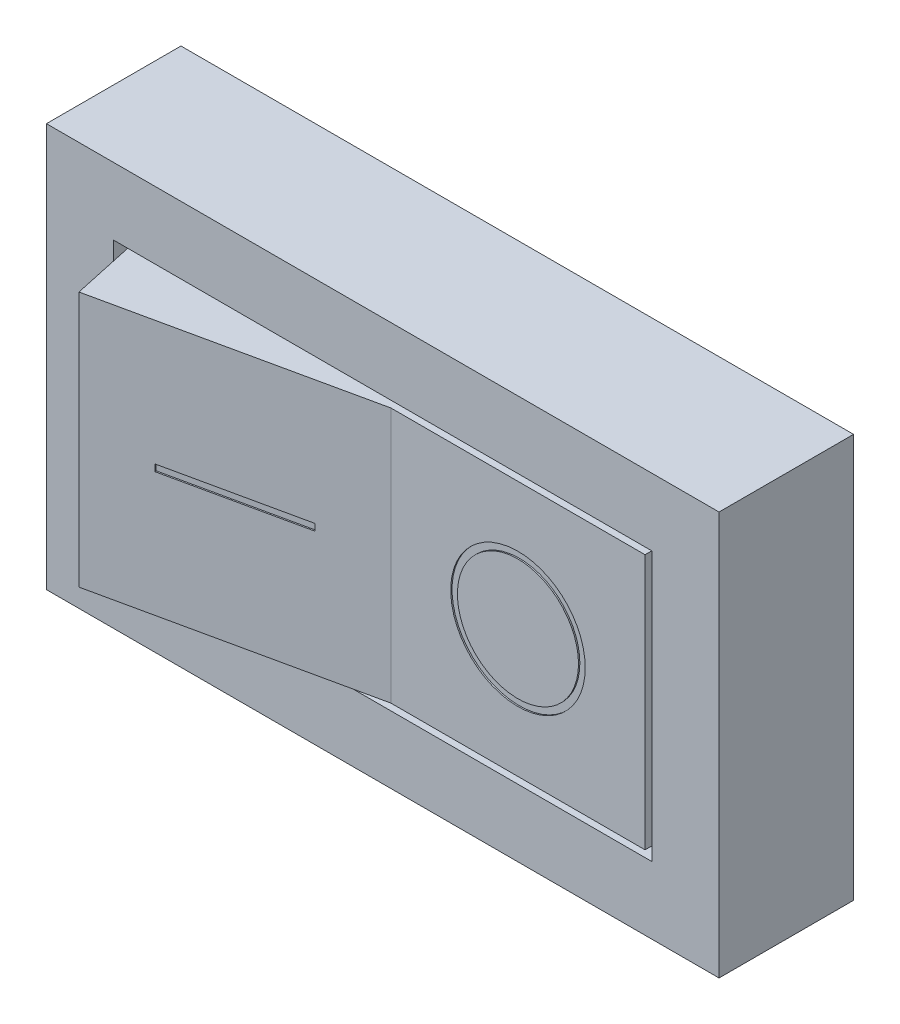
ISO-10303-21;
HEADER;
FILE_DESCRIPTION(('STEP AP214'),'2;1');
FILE_NAME('part.step','',(''),(''),'','','');
FILE_SCHEMA(('AUTOMOTIVE_DESIGN { 1 0 10303 214 1 1 1 1 }'));
ENDSEC;
DATA;
#1=APPLICATION_CONTEXT('core data for automotive mechanical design processes');
#2=APPLICATION_PROTOCOL_DEFINITION('international standard','automotive_design',2000,#1);
#3=PRODUCT_CONTEXT('',#1,'mechanical');
#4=PRODUCT('Part','Part','',(#3));
#5=PRODUCT_RELATED_PRODUCT_CATEGORY('part','',(#4));
#6=PRODUCT_DEFINITION_FORMATION('','',#4);
#7=PRODUCT_DEFINITION_CONTEXT('part definition',#1,'design');
#8=PRODUCT_DEFINITION('design','',#6,#7);
#9=PRODUCT_DEFINITION_SHAPE('','',#8);
#10=(LENGTH_UNIT() NAMED_UNIT(*) SI_UNIT(.MILLI.,.METRE.));
#11=(NAMED_UNIT(*) PLANE_ANGLE_UNIT() SI_UNIT($,.RADIAN.));
#12=(NAMED_UNIT(*) SI_UNIT($,.STERADIAN.) SOLID_ANGLE_UNIT());
#13=UNCERTAINTY_MEASURE_WITH_UNIT(LENGTH_MEASURE(1.E-05),#10,'distance_accuracy_value','');
#14=(GEOMETRIC_REPRESENTATION_CONTEXT(3) GLOBAL_UNCERTAINTY_ASSIGNED_CONTEXT((#13)) GLOBAL_UNIT_ASSIGNED_CONTEXT((#10,
#11,#12)) REPRESENTATION_CONTEXT('',''));
#15=CARTESIAN_POINT('',(0.,0.,0.));
#16=DIRECTION('',(0.,0.,1.));
#17=DIRECTION('',(1.,0.,0.));
#18=AXIS2_PLACEMENT_3D('',#15,#16,#17);
#19=CARTESIAN_POINT('',(0.141550344407691,-8.5259383359687,10.));
#20=DIRECTION('',(0.,1.,0.));
#21=DIRECTION('',(0.,0.,1.));
#22=AXIS2_PLACEMENT_3D('',#19,#20,#21);
#23=PLANE('',#22);
#24=DIRECTION('',(1.,0.,0.));
#25=VECTOR('',#24,1.);
#26=CARTESIAN_POINT('',(0.141550344407691,-8.5259383359687,10.));
#27=LINE('',#26,#25);
#28=CARTESIAN_POINT('',(1.24615811867557,-8.5259383359687,10.));
#29=VERTEX_POINT('',#28);
#30=CARTESIAN_POINT('',(20.1415503444077,-8.5259383359687,10.));
#31=VERTEX_POINT('',#30);
#32=EDGE_CURVE('E220',#29,#31,#27,.T.);
#33=ORIENTED_EDGE('',*,*,#32,.F.);
#34=DIRECTION('',(0.977349842779431,0.,-0.211630065961862));
#35=VECTOR('',#34,1.);
#36=CARTESIAN_POINT('',(-17.8121638155233,-8.5259383359687,14.1267862862563));
#37=LINE('',#36,#35);
#38=CARTESIAN_POINT('',(-17.8121638155233,-8.5259383359687,14.1267862862563));
#39=VERTEX_POINT('',#38);
#40=EDGE_CURVE('E208',#39,#29,#37,.T.);
#41=ORIENTED_EDGE('',*,*,#40,.F.);
#42=DIRECTION('',(0.211630065961862,0.,0.977349842779431));
#43=VECTOR('',#42,1.);
#44=CARTESIAN_POINT('',(-17.8121638155233,-8.5259383359687,14.1267862862563));
#45=LINE('',#44,#43);
#46=CARTESIAN_POINT('',(-18.8948368600087,-8.5259383359687,9.12678628625632));
#47=VERTEX_POINT('',#46);
#48=EDGE_CURVE('E206',#47,#39,#45,.T.);
#49=ORIENTED_EDGE('',*,*,#48,.F.);
#50=DIRECTION('',(0.977349842779431,0.,-0.211630065961862));
#51=VECTOR('',#50,1.);
#52=CARTESIAN_POINT('',(-18.8948368600087,-8.5259383359687,9.12678628625632));
#53=LINE('',#52,#51);
#54=CARTESIAN_POINT('',(0.163485074190188,-8.5259383359687,5.));
#55=VERTEX_POINT('',#54);
#56=EDGE_CURVE('E210',#47,#55,#53,.T.);
#57=ORIENTED_EDGE('',*,*,#56,.T.);
#58=DIRECTION('',(1.,0.,0.));
#59=VECTOR('',#58,1.);
#60=CARTESIAN_POINT('',(0.141550344407691,-8.5259383359687,5.));
#61=LINE('',#60,#59);
#62=CARTESIAN_POINT('',(20.1415503444077,-8.5259383359687,5.));
#63=VERTEX_POINT('',#62);
#64=EDGE_CURVE('E219',#55,#63,#61,.T.);
#65=ORIENTED_EDGE('',*,*,#64,.T.);
#66=DIRECTION('',(0.,0.,-1.));
#67=VECTOR('',#66,1.);
#68=CARTESIAN_POINT('',(20.1415503444077,-8.5259383359687,10.));
#69=LINE('',#68,#67);
#70=EDGE_CURVE('E80',#31,#63,#69,.T.);
#71=ORIENTED_EDGE('',*,*,#70,.F.);
#72=EDGE_LOOP('',(#33,#41,#49,#57,#65,#71));
#73=FACE_BOUND('',#72,.T.);
#74=ADVANCED_FACE('F73',(#73),#23,.F.);
#75=CARTESIAN_POINT('',(20.1415503444077,10.4740616640313,10.));
#76=DIRECTION('',(-1.,0.,0.));
#77=DIRECTION('',(0.,0.,1.));
#78=AXIS2_PLACEMENT_3D('',#75,#76,#77);
#79=PLANE('',#78);
#80=DIRECTION('',(0.,1.,0.));
#81=VECTOR('',#80,1.);
#82=CARTESIAN_POINT('',(20.1415503444077,10.4740616640313,5.));
#83=LINE('',#82,#81);
#84=CARTESIAN_POINT('',(20.1415503444077,10.4740616640313,5.));
#85=VERTEX_POINT('',#84);
#86=EDGE_CURVE('E230',#63,#85,#83,.T.);
#87=ORIENTED_EDGE('',*,*,#86,.T.);
#88=DIRECTION('',(0.,0.,-1.));
#89=VECTOR('',#88,1.);
#90=CARTESIAN_POINT('',(20.1415503444077,10.4740616640313,10.));
#91=LINE('',#90,#89);
#92=CARTESIAN_POINT('',(20.1415503444077,10.4740616640313,10.));
#93=VERTEX_POINT('',#92);
#94=EDGE_CURVE('E228',#93,#85,#91,.T.);
#95=ORIENTED_EDGE('',*,*,#94,.F.);
#96=DIRECTION('',(0.,1.,0.));
#97=VECTOR('',#96,1.);
#98=CARTESIAN_POINT('',(20.1415503444077,10.4740616640313,10.));
#99=LINE('',#98,#97);
#100=EDGE_CURVE('E222',#31,#93,#99,.T.);
#101=ORIENTED_EDGE('',*,*,#100,.F.);
#102=ORIENTED_EDGE('',*,*,#70,.T.);
#103=EDGE_LOOP('',(#87,#95,#101,#102));
#104=FACE_BOUND('',#103,.T.);
#105=ADVANCED_FACE('F240',(#104),#79,.F.);
#106=CARTESIAN_POINT('',(0.141550344407688,10.4740616640313,10.));
#107=DIRECTION('',(0.,-1.,0.));
#108=DIRECTION('',(0.,0.,-1.));
#109=AXIS2_PLACEMENT_3D('',#106,#107,#108);
#110=PLANE('',#109);
#111=DIRECTION('',(-1.,0.,0.));
#112=VECTOR('',#111,1.);
#113=CARTESIAN_POINT('',(0.141550344407688,10.4740616640313,5.));
#114=LINE('',#113,#112);
#115=CARTESIAN_POINT('',(0.163485074190189,10.4740616640313,5.));
#116=VERTEX_POINT('',#115);
#117=EDGE_CURVE('E223',#85,#116,#114,.T.);
#118=ORIENTED_EDGE('',*,*,#117,.T.);
#119=DIRECTION('',(0.977349842779431,0.,-0.211630065961862));
#120=VECTOR('',#119,1.);
#121=CARTESIAN_POINT('',(-18.8948368600087,10.4740616640313,9.12678628625632));
#122=LINE('',#121,#120);
#123=CARTESIAN_POINT('',(-18.8948368600087,10.4740616640313,9.12678628625632));
#124=VERTEX_POINT('',#123);
#125=EDGE_CURVE('E95',#124,#116,#122,.T.);
#126=ORIENTED_EDGE('',*,*,#125,.F.);
#127=DIRECTION('',(-0.211630065961862,0.,-0.977349842779431));
#128=VECTOR('',#127,1.);
#129=CARTESIAN_POINT('',(-17.8121638155233,10.4740616640313,14.1267862862563));
#130=LINE('',#129,#128);
#131=CARTESIAN_POINT('',(-17.8121638155233,10.4740616640313,14.1267862862563));
#132=VERTEX_POINT('',#131);
#133=EDGE_CURVE('E202',#132,#124,#130,.T.);
#134=ORIENTED_EDGE('',*,*,#133,.F.);
#135=DIRECTION('',(0.977349842779431,0.,-0.211630065961862));
#136=VECTOR('',#135,1.);
#137=CARTESIAN_POINT('',(-17.8121638155233,10.4740616640313,14.1267862862563));
#138=LINE('',#137,#136);
#139=CARTESIAN_POINT('',(1.24615811867557,10.4740616640313,10.));
#140=VERTEX_POINT('',#139);
#141=EDGE_CURVE('E214',#132,#140,#138,.T.);
#142=ORIENTED_EDGE('',*,*,#141,.T.);
#143=DIRECTION('',(-1.,0.,0.));
#144=VECTOR('',#143,1.);
#145=CARTESIAN_POINT('',(0.141550344407688,10.4740616640313,10.));
#146=LINE('',#145,#144);
#147=EDGE_CURVE('E225',#93,#140,#146,.T.);
#148=ORIENTED_EDGE('',*,*,#147,.F.);
#149=ORIENTED_EDGE('',*,*,#94,.T.);
#150=EDGE_LOOP('',(#118,#126,#134,#142,#148,#149));
#151=FACE_BOUND('',#150,.T.);
#152=ADVANCED_FACE('F249',(#151),#110,.F.);
#153=CARTESIAN_POINT('',(0.,0.,10.));
#154=DIRECTION('',(0.,0.,1.));
#155=DIRECTION('',(1.,0.,0.));
#156=AXIS2_PLACEMENT_3D('',#153,#154,#155);
#157=PLANE('',#156);
#158=CARTESIAN_POINT('',(10.6938542315416,0.974061664031302,10.));
#159=DIRECTION('',(0.,0.,1.));
#160=DIRECTION('',(1.,0.,0.));
#161=AXIS2_PLACEMENT_3D('',#158,#159,#160);
#162=CIRCLE('',#161,5.);
#163=CARTESIAN_POINT('',(15.6938542315416,0.974061664031302,10.));
#164=VERTEX_POINT('',#163);
#165=EDGE_CURVE('E191',#164,#164,#162,.T.);
#166=ORIENTED_EDGE('',*,*,#165,.F.);
#167=EDGE_LOOP('',(#166));
#168=FACE_BOUND('',#167,.T.);
#169=DIRECTION('',(0.,-1.,0.));
#170=VECTOR('',#169,1.);
#171=CARTESIAN_POINT('',(1.24615811867557,10.4740616640313,10.));
#172=LINE('',#171,#170);
#173=EDGE_CURVE('E216',#140,#29,#172,.T.);
#174=ORIENTED_EDGE('',*,*,#173,.T.);
#175=ORIENTED_EDGE('',*,*,#32,.T.);
#176=ORIENTED_EDGE('',*,*,#100,.T.);
#177=ORIENTED_EDGE('',*,*,#147,.T.);
#178=EDGE_LOOP('',(#174,#175,#176,#177));
#179=FACE_BOUND('',#178,.T.);
#180=ADVANCED_FACE('F254',(#168,#179),#157,.T.);
#181=CARTESIAN_POINT('',(0.,0.,5.));
#182=DIRECTION('',(0.,0.,1.));
#183=DIRECTION('',(1.,0.,0.));
#184=AXIS2_PLACEMENT_3D('',#181,#182,#183);
#185=PLANE('',#184);
#186=ORIENTED_EDGE('',*,*,#64,.F.);
#187=DIRECTION('',(0.,1.,0.));
#188=VECTOR('',#187,1.);
#189=CARTESIAN_POINT('',(0.163485074190189,0.,5.));
#190=LINE('',#189,#188);
#191=EDGE_CURVE('E13',#55,#116,#190,.T.);
#192=ORIENTED_EDGE('',*,*,#191,.T.);
#193=ORIENTED_EDGE('',*,*,#117,.F.);
#194=ORIENTED_EDGE('',*,*,#86,.F.);
#195=EDGE_LOOP('',(#186,#192,#193,#194));
#196=FACE_BOUND('',#195,.T.);
#197=ADVANCED_FACE('F247',(#196),#185,.F.);
#198=CARTESIAN_POINT('',(-17.8121638155233,10.4740616640313,14.1267862862563));
#199=DIRECTION('',(-0.211630065961862,0.,-0.977349842779431));
#200=DIRECTION('',(-0.977349842779431,0.,0.211630065961862));
#201=AXIS2_PLACEMENT_3D('',#198,#199,#200);
#202=PLANE('',#201);
#203=DIRECTION('',(0.977349842779431,0.,-0.211630065961862));
#204=VECTOR('',#203,1.);
#205=CARTESIAN_POINT('',(-13.169752062321,0.724061664031307,13.1215434729375));
#206=LINE('',#205,#204);
#207=CARTESIAN_POINT('',(-13.169752062321,0.724061664031307,13.1215434729375));
#208=VERTEX_POINT('',#207);
#209=CARTESIAN_POINT('',(-3.39625363452673,0.724061664031307,11.0052428133188));
#210=VERTEX_POINT('',#209);
#211=EDGE_CURVE('E178',#208,#210,#206,.T.);
#212=ORIENTED_EDGE('',*,*,#211,.F.);
#213=DIRECTION('',(0.,-1.,0.));
#214=VECTOR('',#213,1.);
#215=CARTESIAN_POINT('',(-13.169752062321,1.22406166403131,13.1215434729375));
#216=LINE('',#215,#214);
#217=CARTESIAN_POINT('',(-13.169752062321,1.22406166403131,13.1215434729375));
#218=VERTEX_POINT('',#217);
#219=EDGE_CURVE('E87',#218,#208,#216,.T.);
#220=ORIENTED_EDGE('',*,*,#219,.F.);
#221=DIRECTION('',(-0.977349842779431,0.,0.211630065961862));
#222=VECTOR('',#221,1.);
#223=CARTESIAN_POINT('',(-13.169752062321,1.22406166403131,13.1215434729375));
#224=LINE('',#223,#222);
#225=CARTESIAN_POINT('',(-3.39625363452673,1.22406166403131,11.0052428133188));
#226=VERTEX_POINT('',#225);
#227=EDGE_CURVE('E169',#226,#218,#224,.T.);
#228=ORIENTED_EDGE('',*,*,#227,.F.);
#229=DIRECTION('',(0.,1.,0.));
#230=VECTOR('',#229,1.);
#231=CARTESIAN_POINT('',(-3.39625363452673,1.22406166403131,11.0052428133188));
#232=LINE('',#231,#230);
#233=EDGE_CURVE('E172',#210,#226,#232,.T.);
#234=ORIENTED_EDGE('',*,*,#233,.F.);
#235=EDGE_LOOP('',(#212,#220,#228,#234));
#236=FACE_BOUND('',#235,.T.);
#237=ORIENTED_EDGE('',*,*,#173,.F.);
#238=ORIENTED_EDGE('',*,*,#141,.F.);
#239=DIRECTION('',(0.,1.,0.));
#240=VECTOR('',#239,1.);
#241=CARTESIAN_POINT('',(-17.8121638155233,10.4740616640313,14.1267862862563));
#242=LINE('',#241,#240);
#243=EDGE_CURVE('E197',#39,#132,#242,.T.);
#244=ORIENTED_EDGE('',*,*,#243,.F.);
#245=ORIENTED_EDGE('',*,*,#40,.T.);
#246=EDGE_LOOP('',(#237,#238,#244,#245));
#247=FACE_BOUND('',#246,.T.);
#248=ADVANCED_FACE('F259',(#236,#247),#202,.F.);
#249=CARTESIAN_POINT('',(-18.8948368600087,10.4740616640313,9.12678628625632));
#250=DIRECTION('',(0.211630065961862,0.,0.977349842779431));
#251=DIRECTION('',(0.977349842779431,0.,-0.211630065961862));
#252=AXIS2_PLACEMENT_3D('',#249,#250,#251);
#253=PLANE('',#252);
#254=ORIENTED_EDGE('',*,*,#191,.F.);
#255=ORIENTED_EDGE('',*,*,#56,.F.);
#256=DIRECTION('',(0.,-1.,0.));
#257=VECTOR('',#256,1.);
#258=CARTESIAN_POINT('',(-18.8948368600087,10.4740616640313,9.12678628625632));
#259=LINE('',#258,#257);
#260=EDGE_CURVE('E204',#124,#47,#259,.T.);
#261=ORIENTED_EDGE('',*,*,#260,.F.);
#262=ORIENTED_EDGE('',*,*,#125,.T.);
#263=EDGE_LOOP('',(#254,#255,#261,#262));
#264=FACE_BOUND('',#263,.T.);
#265=ADVANCED_FACE('F263',(#264),#253,.F.);
#266=CARTESIAN_POINT('',(-19.9363419710663,0.,4.31690801154319));
#267=DIRECTION('',(0.977349842779431,0.,-0.211630065961862));
#268=DIRECTION('',(-0.211630065961862,0.,-0.977349842779431));
#269=AXIS2_PLACEMENT_3D('',#266,#267,#268);
#270=PLANE('',#269);
#271=ORIENTED_EDGE('',*,*,#243,.T.);
#272=ORIENTED_EDGE('',*,*,#133,.T.);
#273=ORIENTED_EDGE('',*,*,#260,.T.);
#274=ORIENTED_EDGE('',*,*,#48,.T.);
#275=EDGE_LOOP('',(#271,#272,#273,#274));
#276=FACE_BOUND('',#275,.T.);
#277=ADVANCED_FACE('F261',(#276),#270,.F.);
#278=CARTESIAN_POINT('',(10.6938542315416,0.974061664031302,9.9));
#279=DIRECTION('',(0.,0.,1.));
#280=DIRECTION('',(1.,0.,0.));
#281=AXIS2_PLACEMENT_3D('',#278,#279,#280);
#282=CYLINDRICAL_SURFACE('',#281,5.);
#283=CARTESIAN_POINT('',(10.6938542315416,0.974061664031302,9.9));
#284=DIRECTION('',(0.,0.,1.));
#285=DIRECTION('',(1.,0.,0.));
#286=AXIS2_PLACEMENT_3D('',#283,#284,#285);
#287=CIRCLE('',#286,5.);
#288=CARTESIAN_POINT('',(15.6938542315416,0.974061664031302,9.9));
#289=VERTEX_POINT('',#288);
#290=EDGE_CURVE('E194',#289,#289,#287,.T.);
#291=ORIENTED_EDGE('',*,*,#290,.F.);
#292=EDGE_LOOP('',(#291));
#293=FACE_BOUND('',#292,.T.);
#294=ORIENTED_EDGE('',*,*,#165,.T.);
#295=EDGE_LOOP('',(#294));
#296=FACE_BOUND('',#295,.T.);
#297=ADVANCED_FACE('F270',(#293,#296),#282,.F.);
#298=CARTESIAN_POINT('',(10.6938542315416,0.974061664031302,9.9));
#299=DIRECTION('',(0.,0.,1.));
#300=DIRECTION('',(1.,0.,0.));
#301=AXIS2_PLACEMENT_3D('',#298,#299,#300);
#302=PLANE('',#301);
#303=CARTESIAN_POINT('',(10.6938542315416,0.974061664031302,9.9));
#304=DIRECTION('',(0.,0.,1.));
#305=DIRECTION('',(1.,0.,0.));
#306=AXIS2_PLACEMENT_3D('',#303,#304,#305);
#307=CIRCLE('',#306,4.5);
#308=CARTESIAN_POINT('',(15.1938542315416,0.974061664031302,9.9));
#309=VERTEX_POINT('',#308);
#310=EDGE_CURVE('E188',#309,#309,#307,.T.);
#311=ORIENTED_EDGE('',*,*,#310,.F.);
#312=EDGE_LOOP('',(#311));
#313=FACE_BOUND('',#312,.T.);
#314=ORIENTED_EDGE('',*,*,#290,.T.);
#315=EDGE_LOOP('',(#314));
#316=FACE_BOUND('',#315,.T.);
#317=ADVANCED_FACE('F300',(#313,#316),#302,.T.);
#318=CARTESIAN_POINT('',(10.6938542315416,0.974061664031302,9.9));
#319=DIRECTION('',(0.,0.,1.));
#320=DIRECTION('',(1.,0.,0.));
#321=AXIS2_PLACEMENT_3D('',#318,#319,#320);
#322=CYLINDRICAL_SURFACE('',#321,4.5);
#323=ORIENTED_EDGE('',*,*,#310,.T.);
#324=EDGE_LOOP('',(#323));
#325=FACE_BOUND('',#324,.T.);
#326=CARTESIAN_POINT('',(10.6938542315416,0.974061664031302,10.));
#327=DIRECTION('',(0.,0.,1.));
#328=DIRECTION('',(1.,0.,0.));
#329=AXIS2_PLACEMENT_3D('',#326,#327,#328);
#330=CIRCLE('',#329,4.5);
#331=CARTESIAN_POINT('',(15.1938542315416,0.974061664031302,10.));
#332=VERTEX_POINT('',#331);
#333=EDGE_CURVE('E184',#332,#332,#330,.T.);
#334=ORIENTED_EDGE('',*,*,#333,.F.);
#335=EDGE_LOOP('',(#334));
#336=FACE_BOUND('',#335,.T.);
#337=ADVANCED_FACE('F292',(#325,#336),#322,.T.);
#338=ORIENTED_EDGE('',*,*,#333,.T.);
#339=EDGE_LOOP('',(#338));
#340=FACE_BOUND('',#339,.T.);
#341=ADVANCED_FACE('F287',(#340),#157,.T.);
#342=CARTESIAN_POINT('',(-13.1909150689172,1.22406166403131,13.0238084886595));
#343=DIRECTION('',(-0.97734984277943,0.,0.211630065961862));
#344=DIRECTION('',(0.211630065961862,0.,0.977349842779431));
#345=AXIS2_PLACEMENT_3D('',#342,#343,#344);
#346=PLANE('',#345);
#347=ORIENTED_EDGE('',*,*,#219,.T.);
#348=DIRECTION('',(0.211630065961862,0.,0.97734984277943));
#349=VECTOR('',#348,1.);
#350=CARTESIAN_POINT('',(-13.1909150689172,0.724061664031307,13.0238084886595));
#351=LINE('',#350,#349);
#352=CARTESIAN_POINT('',(-13.1909150689172,0.724061664031307,13.0238084886595));
#353=VERTEX_POINT('',#352);
#354=EDGE_CURVE('E147',#353,#208,#351,.T.);
#355=ORIENTED_EDGE('',*,*,#354,.F.);
#356=DIRECTION('',(0.,-1.,0.));
#357=VECTOR('',#356,1.);
#358=CARTESIAN_POINT('',(-13.1909150689172,1.22406166403131,13.0238084886595));
#359=LINE('',#358,#357);
#360=CARTESIAN_POINT('',(-13.1909150689172,1.22406166403131,13.0238084886595));
#361=VERTEX_POINT('',#360);
#362=EDGE_CURVE('E151',#361,#353,#359,.T.);
#363=ORIENTED_EDGE('',*,*,#362,.F.);
#364=DIRECTION('',(0.211630065961862,0.,0.97734984277943));
#365=VECTOR('',#364,1.);
#366=CARTESIAN_POINT('',(-13.1909150689172,1.22406166403131,13.0238084886595));
#367=LINE('',#366,#365);
#368=EDGE_CURVE('E182',#361,#218,#367,.T.);
#369=ORIENTED_EDGE('',*,*,#368,.T.);
#370=EDGE_LOOP('',(#347,#355,#363,#369));
#371=FACE_BOUND('',#370,.T.);
#372=ADVANCED_FACE('F149',(#371),#346,.F.);
#373=CARTESIAN_POINT('',(-13.1909150689172,1.22406166403131,13.0238084886595));
#374=DIRECTION('',(0.,1.,0.));
#375=DIRECTION('',(0.,0.,1.));
#376=AXIS2_PLACEMENT_3D('',#373,#374,#375);
#377=PLANE('',#376);
#378=ORIENTED_EDGE('',*,*,#227,.T.);
#379=ORIENTED_EDGE('',*,*,#368,.F.);
#380=DIRECTION('',(-0.977349842779431,0.,0.211630065961862));
#381=VECTOR('',#380,1.);
#382=CARTESIAN_POINT('',(-13.1909150689172,1.22406166403131,13.0238084886595));
#383=LINE('',#382,#381);
#384=CARTESIAN_POINT('',(-3.41741664112291,1.22406166403131,10.9075078290409));
#385=VERTEX_POINT('',#384);
#386=EDGE_CURVE('E157',#385,#361,#383,.T.);
#387=ORIENTED_EDGE('',*,*,#386,.F.);
#388=DIRECTION('',(0.211630065961862,0.,0.97734984277943));
#389=VECTOR('',#388,1.);
#390=CARTESIAN_POINT('',(-3.41741664112291,1.22406166403131,10.9075078290409));
#391=LINE('',#390,#389);
#392=EDGE_CURVE('E185',#385,#226,#391,.T.);
#393=ORIENTED_EDGE('',*,*,#392,.T.);
#394=EDGE_LOOP('',(#378,#379,#387,#393));
#395=FACE_BOUND('',#394,.T.);
#396=ADVANCED_FACE('F298',(#395),#377,.F.);
#397=CARTESIAN_POINT('',(-3.41741664112291,1.22406166403131,10.9075078290409));
#398=DIRECTION('',(0.97734984277943,0.,-0.211630065961862));
#399=DIRECTION('',(-0.211630065961862,0.,-0.977349842779431));
#400=AXIS2_PLACEMENT_3D('',#397,#398,#399);
#401=PLANE('',#400);
#402=ORIENTED_EDGE('',*,*,#233,.T.);
#403=ORIENTED_EDGE('',*,*,#392,.F.);
#404=DIRECTION('',(0.,1.,0.));
#405=VECTOR('',#404,1.);
#406=CARTESIAN_POINT('',(-3.41741664112291,1.22406166403131,10.9075078290409));
#407=LINE('',#406,#405);
#408=CARTESIAN_POINT('',(-3.41741664112291,0.724061664031307,10.9075078290409));
#409=VERTEX_POINT('',#408);
#410=EDGE_CURVE('E165',#409,#385,#407,.T.);
#411=ORIENTED_EDGE('',*,*,#410,.F.);
#412=DIRECTION('',(0.211630065961862,0.,0.97734984277943));
#413=VECTOR('',#412,1.);
#414=CARTESIAN_POINT('',(-3.41741664112291,0.724061664031307,10.9075078290409));
#415=LINE('',#414,#413);
#416=EDGE_CURVE('E156',#409,#210,#415,.T.);
#417=ORIENTED_EDGE('',*,*,#416,.T.);
#418=EDGE_LOOP('',(#402,#403,#411,#417));
#419=FACE_BOUND('',#418,.T.);
#420=ADVANCED_FACE('F357',(#419),#401,.F.);
#421=CARTESIAN_POINT('',(-13.1909150689172,0.724061664031307,13.0238084886595));
#422=DIRECTION('',(0.,-1.,0.));
#423=DIRECTION('',(0.,0.,-1.));
#424=AXIS2_PLACEMENT_3D('',#421,#422,#423);
#425=PLANE('',#424);
#426=ORIENTED_EDGE('',*,*,#211,.T.);
#427=ORIENTED_EDGE('',*,*,#416,.F.);
#428=DIRECTION('',(0.977349842779431,0.,-0.211630065961862));
#429=VECTOR('',#428,1.);
#430=CARTESIAN_POINT('',(-13.1909150689172,0.724061664031307,13.0238084886595));
#431=LINE('',#430,#429);
#432=EDGE_CURVE('E160',#353,#409,#431,.T.);
#433=ORIENTED_EDGE('',*,*,#432,.F.);
#434=ORIENTED_EDGE('',*,*,#354,.T.);
#435=EDGE_LOOP('',(#426,#427,#433,#434));
#436=FACE_BOUND('',#435,.T.);
#437=ADVANCED_FACE('F161',(#436),#425,.F.);
#438=CARTESIAN_POINT('',(2.10301514894674,0.,9.71214329043519));
#439=DIRECTION('',(0.211630065961862,0.,0.977349842779431));
#440=DIRECTION('',(0.977349842779431,0.,-0.211630065961862));
#441=AXIS2_PLACEMENT_3D('',#438,#439,#440);
#442=PLANE('',#441);
#443=ORIENTED_EDGE('',*,*,#362,.T.);
#444=ORIENTED_EDGE('',*,*,#432,.T.);
#445=ORIENTED_EDGE('',*,*,#410,.T.);
#446=ORIENTED_EDGE('',*,*,#386,.T.);
#447=EDGE_LOOP('',(#443,#444,#445,#446));
#448=FACE_BOUND('',#447,.T.);
#449=ADVANCED_FACE('F167',(#448),#442,.T.);
#450=CLOSED_SHELL('',(#74,#105,#152,#180,#197,#248,#265,#277,#297,#317,#337,#341,#372,#396,#420,
#437,#449));
#451=MANIFOLD_SOLID_BREP('B2',#450);
#452=CARTESIAN_POINT('',(0.,0.,10.));
#453=DIRECTION('',(0.,0.,1.));
#454=DIRECTION('',(1.,0.,0.));
#455=AXIS2_PLACEMENT_3D('',#452,#453,#454);
#456=PLANE('',#455);
#457=DIRECTION('',(0.,-1.,0.));
#458=VECTOR('',#457,1.);
#459=CARTESIAN_POINT('',(-24.3584496555923,10.9740616640313,10.));
#460=LINE('',#459,#458);
#461=CARTESIAN_POINT('',(-24.3584496555923,15.9740616640313,10.));
#462=VERTEX_POINT('',#461);
#463=CARTESIAN_POINT('',(-24.3584496555923,-14.0259383359687,10.));
#464=VERTEX_POINT('',#463);
#465=EDGE_CURVE('E543',#462,#464,#460,.T.);
#466=ORIENTED_EDGE('',*,*,#465,.T.);
#467=DIRECTION('',(1.,0.,0.));
#468=VECTOR('',#467,1.);
#469=CARTESIAN_POINT('',(-19.3584496555923,-14.0259383359687,10.));
#470=LINE('',#469,#468);
#471=CARTESIAN_POINT('',(25.6415503444077,-14.0259383359687,10.));
#472=VERTEX_POINT('',#471);
#473=EDGE_CURVE('E547',#464,#472,#470,.T.);
#474=ORIENTED_EDGE('',*,*,#473,.T.);
#475=DIRECTION('',(0.,1.,0.));
#476=VECTOR('',#475,1.);
#477=CARTESIAN_POINT('',(25.6415503444077,10.9740616640313,10.));
#478=LINE('',#477,#476);
#479=CARTESIAN_POINT('',(25.6415503444077,15.9740616640313,10.));
#480=VERTEX_POINT('',#479);
#481=EDGE_CURVE('E551',#472,#480,#478,.T.);
#482=ORIENTED_EDGE('',*,*,#481,.T.);
#483=DIRECTION('',(-1.,0.,0.));
#484=VECTOR('',#483,1.);
#485=CARTESIAN_POINT('',(-19.3584496555923,15.9740616640313,10.));
#486=LINE('',#485,#484);
#487=EDGE_CURVE('E554',#480,#462,#486,.T.);
#488=ORIENTED_EDGE('',*,*,#487,.T.);
#489=EDGE_LOOP('',(#466,#474,#482,#488));
#490=FACE_BOUND('',#489,.T.);
#491=DIRECTION('',(1.,0.,0.));
#492=VECTOR('',#491,1.);
#493=CARTESIAN_POINT('',(-19.3584496555923,-9.0259383359687,10.));
#494=LINE('',#493,#492);
#495=CARTESIAN_POINT('',(-19.3584496555923,-9.0259383359687,10.));
#496=VERTEX_POINT('',#495);
#497=CARTESIAN_POINT('',(20.6415503444077,-9.0259383359687,10.));
#498=VERTEX_POINT('',#497);
#499=EDGE_CURVE('E504',#496,#498,#494,.T.);
#500=ORIENTED_EDGE('',*,*,#499,.F.);
#501=DIRECTION('',(0.,-1.,0.));
#502=VECTOR('',#501,1.);
#503=CARTESIAN_POINT('',(-19.3584496555923,10.9740616640313,10.));
#504=LINE('',#503,#502);
#505=CARTESIAN_POINT('',(-19.3584496555923,10.9740616640313,10.));
#506=VERTEX_POINT('',#505);
#507=EDGE_CURVE('E495',#506,#496,#504,.T.);
#508=ORIENTED_EDGE('',*,*,#507,.F.);
#509=DIRECTION('',(-1.,0.,0.));
#510=VECTOR('',#509,1.);
#511=CARTESIAN_POINT('',(-19.3584496555923,10.9740616640313,10.));
#512=LINE('',#511,#510);
#513=CARTESIAN_POINT('',(20.6415503444077,10.9740616640313,10.));
#514=VERTEX_POINT('',#513);
#515=EDGE_CURVE('E521',#514,#506,#512,.T.);
#516=ORIENTED_EDGE('',*,*,#515,.F.);
#517=DIRECTION('',(0.,1.,0.));
#518=VECTOR('',#517,1.);
#519=CARTESIAN_POINT('',(20.6415503444077,10.9740616640313,10.));
#520=LINE('',#519,#518);
#521=EDGE_CURVE('E517',#498,#514,#520,.T.);
#522=ORIENTED_EDGE('',*,*,#521,.F.);
#523=EDGE_LOOP('',(#500,#508,#516,#522));
#524=FACE_BOUND('',#523,.T.);
#525=ADVANCED_FACE('F429',(#490,#524),#456,.T.);
#526=CARTESIAN_POINT('',(0.,0.,0.));
#527=DIRECTION('',(0.,0.,1.));
#528=DIRECTION('',(1.,0.,0.));
#529=AXIS2_PLACEMENT_3D('',#526,#527,#528);
#530=PLANE('',#529);
#531=DIRECTION('',(0.,-1.,0.));
#532=VECTOR('',#531,1.);
#533=CARTESIAN_POINT('',(-24.3584496555923,10.9740616640313,0.));
#534=LINE('',#533,#532);
#535=CARTESIAN_POINT('',(-24.3584496555923,15.9740616640313,0.));
#536=VERTEX_POINT('',#535);
#537=CARTESIAN_POINT('',(-24.3584496555923,-14.0259383359687,0.));
#538=VERTEX_POINT('',#537);
#539=EDGE_CURVE('E513',#536,#538,#534,.T.);
#540=ORIENTED_EDGE('',*,*,#539,.F.);
#541=DIRECTION('',(-1.,0.,0.));
#542=VECTOR('',#541,1.);
#543=CARTESIAN_POINT('',(-19.3584496555923,15.9740616640313,0.));
#544=LINE('',#543,#542);
#545=CARTESIAN_POINT('',(25.6415503444077,15.9740616640313,0.));
#546=VERTEX_POINT('',#545);
#547=EDGE_CURVE('E548',#546,#536,#544,.T.);
#548=ORIENTED_EDGE('',*,*,#547,.F.);
#549=DIRECTION('',(0.,1.,0.));
#550=VECTOR('',#549,1.);
#551=CARTESIAN_POINT('',(25.6415503444077,10.9740616640313,0.));
#552=LINE('',#551,#550);
#553=CARTESIAN_POINT('',(25.6415503444077,-14.0259383359687,0.));
#554=VERTEX_POINT('',#553);
#555=EDGE_CURVE('E564',#554,#546,#552,.T.);
#556=ORIENTED_EDGE('',*,*,#555,.F.);
#557=DIRECTION('',(1.,0.,0.));
#558=VECTOR('',#557,1.);
#559=CARTESIAN_POINT('',(-19.3584496555923,-14.0259383359687,0.));
#560=LINE('',#559,#558);
#561=EDGE_CURVE('E561',#538,#554,#560,.T.);
#562=ORIENTED_EDGE('',*,*,#561,.F.);
#563=EDGE_LOOP('',(#540,#548,#556,#562));
#564=FACE_BOUND('',#563,.T.);
#565=DIRECTION('',(0.,-1.,0.));
#566=VECTOR('',#565,1.);
#567=CARTESIAN_POINT('',(-19.3584496555923,10.9740616640313,0.));
#568=LINE('',#567,#566);
#569=CARTESIAN_POINT('',(-19.3584496555923,10.9740616640313,0.));
#570=VERTEX_POINT('',#569);
#571=CARTESIAN_POINT('',(-19.3584496555923,-9.0259383359687,0.));
#572=VERTEX_POINT('',#571);
#573=EDGE_CURVE('E453',#570,#572,#568,.T.);
#574=ORIENTED_EDGE('',*,*,#573,.T.);
#575=DIRECTION('',(1.,0.,0.));
#576=VECTOR('',#575,1.);
#577=CARTESIAN_POINT('',(-19.3584496555923,-9.0259383359687,0.));
#578=LINE('',#577,#576);
#579=CARTESIAN_POINT('',(20.6415503444077,-9.0259383359687,0.));
#580=VERTEX_POINT('',#579);
#581=EDGE_CURVE('E511',#572,#580,#578,.T.);
#582=ORIENTED_EDGE('',*,*,#581,.T.);
#583=DIRECTION('',(0.,1.,0.));
#584=VECTOR('',#583,1.);
#585=CARTESIAN_POINT('',(20.6415503444077,10.9740616640313,0.));
#586=LINE('',#585,#584);
#587=CARTESIAN_POINT('',(20.6415503444077,10.9740616640313,0.));
#588=VERTEX_POINT('',#587);
#589=EDGE_CURVE('E530',#580,#588,#586,.T.);
#590=ORIENTED_EDGE('',*,*,#589,.T.);
#591=DIRECTION('',(-1.,0.,0.));
#592=VECTOR('',#591,1.);
#593=CARTESIAN_POINT('',(-19.3584496555923,10.9740616640313,0.));
#594=LINE('',#593,#592);
#595=EDGE_CURVE('E505',#588,#570,#594,.T.);
#596=ORIENTED_EDGE('',*,*,#595,.T.);
#597=EDGE_LOOP('',(#574,#582,#590,#596));
#598=FACE_BOUND('',#597,.T.);
#599=ADVANCED_FACE('F587',(#564,#598),#530,.F.);
#600=CARTESIAN_POINT('',(-24.3584496555923,10.9740616640313,10.));
#601=DIRECTION('',(1.,0.,0.));
#602=DIRECTION('',(0.,0.,-1.));
#603=AXIS2_PLACEMENT_3D('',#600,#601,#602);
#604=PLANE('',#603);
#605=ORIENTED_EDGE('',*,*,#539,.T.);
#606=DIRECTION('',(0.,0.,-1.));
#607=VECTOR('',#606,1.);
#608=CARTESIAN_POINT('',(-24.3584496555923,-14.0259383359687,10.));
#609=LINE('',#608,#607);
#610=EDGE_CURVE('E71',#464,#538,#609,.T.);
#611=ORIENTED_EDGE('',*,*,#610,.F.);
#612=ORIENTED_EDGE('',*,*,#465,.F.);
#613=DIRECTION('',(0.,0.,-1.));
#614=VECTOR('',#613,1.);
#615=CARTESIAN_POINT('',(-24.3584496555923,15.9740616640313,10.));
#616=LINE('',#615,#614);
#617=EDGE_CURVE('E557',#462,#536,#616,.T.);
#618=ORIENTED_EDGE('',*,*,#617,.T.);
#619=EDGE_LOOP('',(#605,#611,#612,#618));
#620=FACE_BOUND('',#619,.T.);
#621=ADVANCED_FACE('F431',(#620),#604,.F.);
#622=CARTESIAN_POINT('',(-19.3584496555923,-14.0259383359687,10.));
#623=DIRECTION('',(0.,1.,0.));
#624=DIRECTION('',(0.,0.,1.));
#625=AXIS2_PLACEMENT_3D('',#622,#623,#624);
#626=PLANE('',#625);
#627=ORIENTED_EDGE('',*,*,#561,.T.);
#628=DIRECTION('',(0.,0.,-1.));
#629=VECTOR('',#628,1.);
#630=CARTESIAN_POINT('',(25.6415503444077,-14.0259383359687,10.));
#631=LINE('',#630,#629);
#632=EDGE_CURVE('E438',#472,#554,#631,.T.);
#633=ORIENTED_EDGE('',*,*,#632,.F.);
#634=ORIENTED_EDGE('',*,*,#473,.F.);
#635=ORIENTED_EDGE('',*,*,#610,.T.);
#636=EDGE_LOOP('',(#627,#633,#634,#635));
#637=FACE_BOUND('',#636,.T.);
#638=ADVANCED_FACE('F597',(#637),#626,.F.);
#639=CARTESIAN_POINT('',(25.6415503444077,10.9740616640313,10.));
#640=DIRECTION('',(-1.,0.,0.));
#641=DIRECTION('',(0.,0.,1.));
#642=AXIS2_PLACEMENT_3D('',#639,#640,#641);
#643=PLANE('',#642);
#644=ORIENTED_EDGE('',*,*,#555,.T.);
#645=DIRECTION('',(0.,0.,-1.));
#646=VECTOR('',#645,1.);
#647=CARTESIAN_POINT('',(25.6415503444077,15.9740616640313,10.));
#648=LINE('',#647,#646);
#649=EDGE_CURVE('E572',#480,#546,#648,.T.);
#650=ORIENTED_EDGE('',*,*,#649,.F.);
#651=ORIENTED_EDGE('',*,*,#481,.F.);
#652=ORIENTED_EDGE('',*,*,#632,.T.);
#653=EDGE_LOOP('',(#644,#650,#651,#652));
#654=FACE_BOUND('',#653,.T.);
#655=ADVANCED_FACE('F581',(#654),#643,.F.);
#656=CARTESIAN_POINT('',(-19.3584496555923,15.9740616640313,10.));
#657=DIRECTION('',(0.,-1.,0.));
#658=DIRECTION('',(0.,0.,-1.));
#659=AXIS2_PLACEMENT_3D('',#656,#657,#658);
#660=PLANE('',#659);
#661=ORIENTED_EDGE('',*,*,#547,.T.);
#662=ORIENTED_EDGE('',*,*,#617,.F.);
#663=ORIENTED_EDGE('',*,*,#487,.F.);
#664=ORIENTED_EDGE('',*,*,#649,.T.);
#665=EDGE_LOOP('',(#661,#662,#663,#664));
#666=FACE_BOUND('',#665,.T.);
#667=ADVANCED_FACE('F591',(#666),#660,.F.);
#668=CARTESIAN_POINT('',(-19.3584496555923,10.9740616640313,10.));
#669=DIRECTION('',(1.,0.,0.));
#670=DIRECTION('',(0.,0.,-1.));
#671=AXIS2_PLACEMENT_3D('',#668,#669,#670);
#672=PLANE('',#671);
#673=ORIENTED_EDGE('',*,*,#573,.F.);
#674=DIRECTION('',(0.,0.,-1.));
#675=VECTOR('',#674,1.);
#676=CARTESIAN_POINT('',(-19.3584496555923,10.9740616640313,10.));
#677=LINE('',#676,#675);
#678=EDGE_CURVE('E499',#506,#570,#677,.T.);
#679=ORIENTED_EDGE('',*,*,#678,.F.);
#680=ORIENTED_EDGE('',*,*,#507,.T.);
#681=DIRECTION('',(0.,0.,-1.));
#682=VECTOR('',#681,1.);
#683=CARTESIAN_POINT('',(-19.3584496555923,-9.0259383359687,10.));
#684=LINE('',#683,#682);
#685=EDGE_CURVE('E498',#496,#572,#684,.T.);
#686=ORIENTED_EDGE('',*,*,#685,.T.);
#687=EDGE_LOOP('',(#673,#679,#680,#686));
#688=FACE_BOUND('',#687,.T.);
#689=ADVANCED_FACE('F497',(#688),#672,.T.);
#690=CARTESIAN_POINT('',(-19.3584496555923,-9.0259383359687,10.));
#691=DIRECTION('',(0.,1.,0.));
#692=DIRECTION('',(0.,0.,1.));
#693=AXIS2_PLACEMENT_3D('',#690,#691,#692);
#694=PLANE('',#693);
#695=ORIENTED_EDGE('',*,*,#581,.F.);
#696=ORIENTED_EDGE('',*,*,#685,.F.);
#697=ORIENTED_EDGE('',*,*,#499,.T.);
#698=DIRECTION('',(0.,0.,-1.));
#699=VECTOR('',#698,1.);
#700=CARTESIAN_POINT('',(20.6415503444077,-9.0259383359687,10.));
#701=LINE('',#700,#699);
#702=EDGE_CURVE('E514',#498,#580,#701,.T.);
#703=ORIENTED_EDGE('',*,*,#702,.T.);
#704=EDGE_LOOP('',(#695,#696,#697,#703));
#705=FACE_BOUND('',#704,.T.);
#706=ADVANCED_FACE('F508',(#705),#694,.T.);
#707=CARTESIAN_POINT('',(20.6415503444077,10.9740616640313,10.));
#708=DIRECTION('',(-1.,0.,0.));
#709=DIRECTION('',(0.,0.,1.));
#710=AXIS2_PLACEMENT_3D('',#707,#708,#709);
#711=PLANE('',#710);
#712=ORIENTED_EDGE('',*,*,#589,.F.);
#713=ORIENTED_EDGE('',*,*,#702,.F.);
#714=ORIENTED_EDGE('',*,*,#521,.T.);
#715=DIRECTION('',(0.,0.,-1.));
#716=VECTOR('',#715,1.);
#717=CARTESIAN_POINT('',(20.6415503444077,10.9740616640313,10.));
#718=LINE('',#717,#716);
#719=EDGE_CURVE('E445',#514,#588,#718,.T.);
#720=ORIENTED_EDGE('',*,*,#719,.T.);
#721=EDGE_LOOP('',(#712,#713,#714,#720));
#722=FACE_BOUND('',#721,.T.);
#723=ADVANCED_FACE('F620',(#722),#711,.T.);
#724=CARTESIAN_POINT('',(-19.3584496555923,10.9740616640313,10.));
#725=DIRECTION('',(0.,-1.,0.));
#726=DIRECTION('',(0.,0.,-1.));
#727=AXIS2_PLACEMENT_3D('',#724,#725,#726);
#728=PLANE('',#727);
#729=ORIENTED_EDGE('',*,*,#595,.F.);
#730=ORIENTED_EDGE('',*,*,#719,.F.);
#731=ORIENTED_EDGE('',*,*,#515,.T.);
#732=ORIENTED_EDGE('',*,*,#678,.T.);
#733=EDGE_LOOP('',(#729,#730,#731,#732));
#734=FACE_BOUND('',#733,.T.);
#735=ADVANCED_FACE('F624',(#734),#728,.T.);
#736=CLOSED_SHELL('',(#525,#599,#621,#638,#655,#667,#689,#706,#723,#735));
#737=MANIFOLD_SOLID_BREP('B7',#736);
#738=ADVANCED_BREP_SHAPE_REPRESENTATION('',(#18,#451,#737),#14);
#739=SHAPE_DEFINITION_REPRESENTATION(#9,#738);
ENDSEC;
END-ISO-10303-21;
